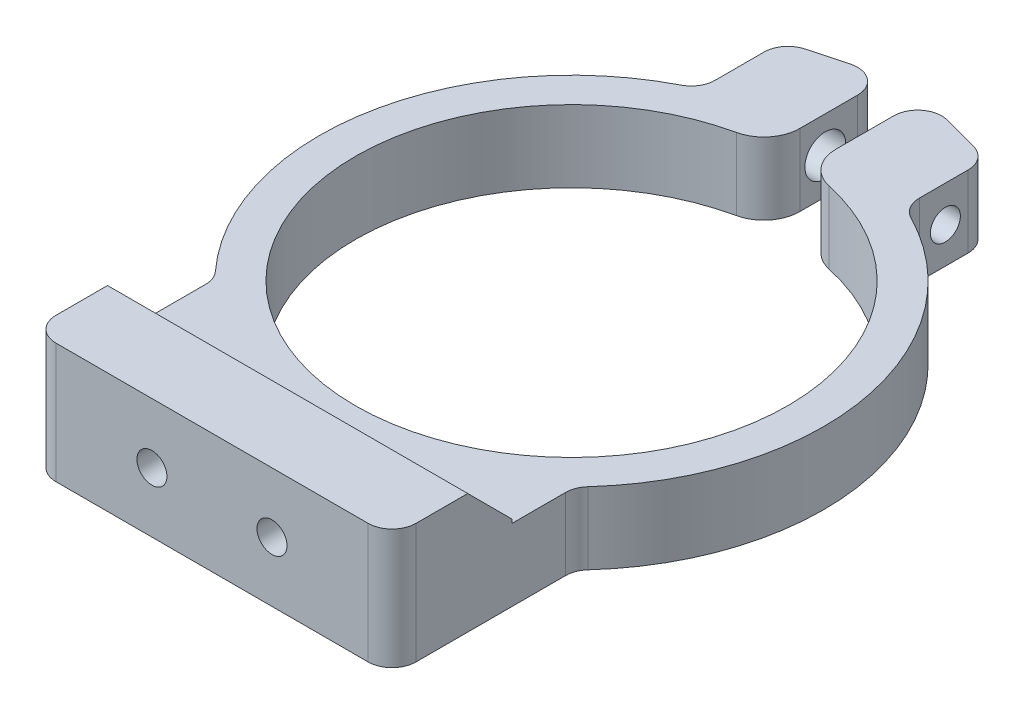
ISO-10303-21;
HEADER;
FILE_DESCRIPTION(('STEP AP214'),'2;1');
FILE_NAME('part.step','',(''),(''),'','','');
FILE_SCHEMA(('AUTOMOTIVE_DESIGN { 1 0 10303 214 1 1 1 1 }'));
ENDSEC;
DATA;
#1=APPLICATION_CONTEXT('core data for automotive mechanical design processes');
#2=APPLICATION_PROTOCOL_DEFINITION('international standard','automotive_design',2000,#1);
#3=PRODUCT_CONTEXT('',#1,'mechanical');
#4=PRODUCT('Part','Part','',(#3));
#5=PRODUCT_RELATED_PRODUCT_CATEGORY('part','',(#4));
#6=PRODUCT_DEFINITION_FORMATION('','',#4);
#7=PRODUCT_DEFINITION_CONTEXT('part definition',#1,'design');
#8=PRODUCT_DEFINITION('design','',#6,#7);
#9=PRODUCT_DEFINITION_SHAPE('','',#8);
#10=(LENGTH_UNIT() NAMED_UNIT(*) SI_UNIT(.MILLI.,.METRE.));
#11=(NAMED_UNIT(*) PLANE_ANGLE_UNIT() SI_UNIT($,.RADIAN.));
#12=(NAMED_UNIT(*) SI_UNIT($,.STERADIAN.) SOLID_ANGLE_UNIT());
#13=UNCERTAINTY_MEASURE_WITH_UNIT(LENGTH_MEASURE(1.E-05),#10,'distance_accuracy_value','');
#14=(GEOMETRIC_REPRESENTATION_CONTEXT(3) GLOBAL_UNCERTAINTY_ASSIGNED_CONTEXT((#13)) GLOBAL_UNIT_ASSIGNED_CONTEXT((#10,
#11,#12)) REPRESENTATION_CONTEXT('',''));
#15=CARTESIAN_POINT('',(0.,0.,0.));
#16=DIRECTION('',(0.,0.,1.));
#17=DIRECTION('',(1.,0.,0.));
#18=AXIS2_PLACEMENT_3D('',#15,#16,#17);
#19=CARTESIAN_POINT('',(0.,6.,0.));
#20=DIRECTION('',(0.,-1.,0.));
#21=DIRECTION('',(0.,0.,-1.));
#22=AXIS2_PLACEMENT_3D('',#19,#20,#21);
#23=CYLINDRICAL_SURFACE('',#22,21.);
#24=CARTESIAN_POINT('',(0.,0.,0.));
#25=DIRECTION('',(0.,1.,0.));
#26=DIRECTION('',(0.,0.,1.));
#27=AXIS2_PLACEMENT_3D('',#24,#25,#26);
#28=CIRCLE('',#27,21.);
#29=CARTESIAN_POINT('',(15.5217391304348,0.,14.1448087426706));
#30=VERTEX_POINT('',#29);
#31=CARTESIAN_POINT('',(9.58695652173913,0.,-18.6839574140567));
#32=VERTEX_POINT('',#31);
#33=EDGE_CURVE('E528',#30,#32,#28,.T.);
#34=ORIENTED_EDGE('',*,*,#33,.T.);
#35=DIRECTION('',(0.,-1.,0.));
#36=VECTOR('',#35,1.);
#37=CARTESIAN_POINT('',(9.58695652173913,6.,-18.6839574140567));
#38=LINE('',#37,#36);
#39=CARTESIAN_POINT('',(9.58695652173913,6.,-18.6839574140567));
#40=VERTEX_POINT('',#39);
#41=EDGE_CURVE('E424',#32,#40,#38,.F.);
#42=ORIENTED_EDGE('',*,*,#41,.T.);
#43=CARTESIAN_POINT('',(0.,6.,0.));
#44=DIRECTION('',(0.,1.,0.));
#45=DIRECTION('',(0.,0.,1.));
#46=AXIS2_PLACEMENT_3D('',#43,#44,#45);
#47=CIRCLE('',#46,21.);
#48=CARTESIAN_POINT('',(15.5217391304348,6.,14.1448087426706));
#49=VERTEX_POINT('',#48);
#50=EDGE_CURVE('E342',#49,#40,#47,.T.);
#51=ORIENTED_EDGE('',*,*,#50,.F.);
#52=DIRECTION('',(0.,-1.,0.));
#53=VECTOR('',#52,1.);
#54=CARTESIAN_POINT('',(15.5217391304348,6.,14.1448087426706));
#55=LINE('',#54,#53);
#56=EDGE_CURVE('E421',#49,#30,#55,.T.);
#57=ORIENTED_EDGE('',*,*,#56,.T.);
#58=EDGE_LOOP('',(#34,#42,#51,#57));
#59=FACE_BOUND('',#58,.T.);
#60=ADVANCED_FACE('F52',(#59),#23,.T.);
#61=CARTESIAN_POINT('',(0.,6.,0.));
#62=DIRECTION('',(0.,1.,0.));
#63=DIRECTION('',(0.,0.,1.));
#64=AXIS2_PLACEMENT_3D('',#61,#62,#63);
#65=PLANE('',#64);
#66=DIRECTION('',(0.,0.,-1.));
#67=VECTOR('',#66,1.);
#68=CARTESIAN_POINT('',(1.5,6.,-16.));
#69=LINE('',#68,#67);
#70=CARTESIAN_POINT('',(1.50000000000001,6.,-20.512191496766));
#71=VERTEX_POINT('',#70);
#72=CARTESIAN_POINT('',(1.50000000000002,6.,-25.3309403689697));
#73=VERTEX_POINT('',#72);
#74=EDGE_CURVE('E322',#71,#73,#69,.T.);
#75=ORIENTED_EDGE('',*,*,#74,.F.);
#76=CARTESIAN_POINT('',(4.50000000000001,6.,-20.512191496766));
#77=DIRECTION('',(0.,1.,0.));
#78=DIRECTION('',(0.,0.,1.));
#79=AXIS2_PLACEMENT_3D('',#76,#77,#78);
#80=CIRCLE('',#79,3.);
#81=CARTESIAN_POINT('',(3.85714285714287,6.,-17.5818784257994));
#82=VERTEX_POINT('',#81);
#83=EDGE_CURVE('E447',#71,#82,#80,.T.);
#84=ORIENTED_EDGE('',*,*,#83,.T.);
#85=CARTESIAN_POINT('',(0.,6.,0.));
#86=DIRECTION('',(0.,1.,0.));
#87=DIRECTION('',(0.,0.,1.));
#88=AXIS2_PLACEMENT_3D('',#85,#86,#87);
#89=CIRCLE('',#88,18.);
#90=CARTESIAN_POINT('',(-3.85714285714287,6.,-17.5818784257994));
#91=VERTEX_POINT('',#90);
#92=EDGE_CURVE('E334',#91,#82,#89,.T.);
#93=ORIENTED_EDGE('',*,*,#92,.F.);
#94=CARTESIAN_POINT('',(-4.50000000000001,6.,-20.512191496766));
#95=DIRECTION('',(0.,1.,0.));
#96=DIRECTION('',(0.,0.,1.));
#97=AXIS2_PLACEMENT_3D('',#94,#95,#96);
#98=CIRCLE('',#97,3.);
#99=CARTESIAN_POINT('',(-1.50000000000001,6.,-20.512191496766));
#100=VERTEX_POINT('',#99);
#101=EDGE_CURVE('E445',#91,#100,#98,.T.);
#102=ORIENTED_EDGE('',*,*,#101,.T.);
#103=DIRECTION('',(0.,0.,1.));
#104=VECTOR('',#103,1.);
#105=CARTESIAN_POINT('',(-1.5,6.,-16.));
#106=LINE('',#105,#104);
#107=CARTESIAN_POINT('',(-1.50000000000002,6.,-25.3309403689697));
#108=VERTEX_POINT('',#107);
#109=EDGE_CURVE('E324',#108,#100,#106,.T.);
#110=ORIENTED_EDGE('',*,*,#109,.F.);
#111=CARTESIAN_POINT('',(-3.50000000000002,6.,-25.3309403689697));
#112=DIRECTION('',(0.,1.,0.));
#113=DIRECTION('',(0.,0.,1.));
#114=AXIS2_PLACEMENT_3D('',#111,#112,#113);
#115=CIRCLE('',#114,2.);
#116=CARTESIAN_POINT('',(-4.01763809020507,6.,-27.2627920215478));
#117=VERTEX_POINT('',#116);
#118=EDGE_CURVE('E358',#108,#117,#115,.T.);
#119=ORIENTED_EDGE('',*,*,#118,.T.);
#120=DIRECTION('',(-0.965925826289067,0.,0.258819045102525));
#121=VECTOR('',#120,1.);
#122=CARTESIAN_POINT('',(-1.5,6.,-27.9373911146521));
#123=LINE('',#122,#121);
#124=CARTESIAN_POINT('',(-7.01763809020506,6.,-26.4589444442544));
#125=VERTEX_POINT('',#124);
#126=EDGE_CURVE('E278',#117,#125,#123,.T.);
#127=ORIENTED_EDGE('',*,*,#126,.T.);
#128=CARTESIAN_POINT('',(-6.5,6.,-24.5270927916763));
#129=DIRECTION('',(0.,1.,0.));
#130=DIRECTION('',(0.,0.,1.));
#131=AXIS2_PLACEMENT_3D('',#128,#129,#130);
#132=CIRCLE('',#131,2.);
#133=CARTESIAN_POINT('',(-8.5,6.,-24.5270927916763));
#134=VERTEX_POINT('',#133);
#135=EDGE_CURVE('E356',#125,#134,#132,.T.);
#136=ORIENTED_EDGE('',*,*,#135,.T.);
#137=DIRECTION('',(0.,0.,1.));
#138=VECTOR('',#137,1.);
#139=CARTESIAN_POINT('',(-8.5,6.,-17.9373911146521));
#140=LINE('',#139,#138);
#141=CARTESIAN_POINT('',(-8.5,6.,-20.4633819296811));
#142=VERTEX_POINT('',#141);
#143=EDGE_CURVE('E283',#134,#142,#140,.T.);
#144=ORIENTED_EDGE('',*,*,#143,.T.);
#145=CARTESIAN_POINT('',(-10.5,6.,-20.4633819296811));
#146=DIRECTION('',(0.,1.,0.));
#147=DIRECTION('',(0.,0.,1.));
#148=AXIS2_PLACEMENT_3D('',#145,#146,#147);
#149=CIRCLE('',#148,2.);
#150=CARTESIAN_POINT('',(-9.58695652173913,6.,-18.6839574140567));
#151=VERTEX_POINT('',#150);
#152=EDGE_CURVE('E441',#142,#151,#149,.F.);
#153=ORIENTED_EDGE('',*,*,#152,.T.);
#154=CARTESIAN_POINT('',(-15.5217391304348,6.,14.1448087426706));
#155=VERTEX_POINT('',#154);
#156=EDGE_CURVE('E346',#151,#155,#47,.T.);
#157=ORIENTED_EDGE('',*,*,#156,.T.);
#158=CARTESIAN_POINT('',(-17.,6.,15.4919333848297));
#159=DIRECTION('',(0.,1.,0.));
#160=DIRECTION('',(0.,0.,1.));
#161=AXIS2_PLACEMENT_3D('',#158,#159,#160);
#162=CIRCLE('',#161,2.);
#163=CARTESIAN_POINT('',(-15.,6.,15.4919333848297));
#164=VERTEX_POINT('',#163);
#165=EDGE_CURVE('E429',#155,#164,#162,.F.);
#166=ORIENTED_EDGE('',*,*,#165,.T.);
#167=DIRECTION('',(0.,0.,1.));
#168=VECTOR('',#167,1.);
#169=CARTESIAN_POINT('',(-15.,6.,14.6969384566991));
#170=LINE('',#169,#168);
#171=CARTESIAN_POINT('',(-15.,6.,19.9498743710662));
#172=VERTEX_POINT('',#171);
#173=EDGE_CURVE('E345',#164,#172,#170,.T.);
#174=ORIENTED_EDGE('',*,*,#173,.T.);
#175=DIRECTION('',(-1.,0.,0.));
#176=VECTOR('',#175,1.);
#177=CARTESIAN_POINT('',(-15.,6.,19.9498743710662));
#178=LINE('',#177,#176);
#179=CARTESIAN_POINT('',(15.,6.,19.9498743710662));
#180=VERTEX_POINT('',#179);
#181=EDGE_CURVE('E290',#180,#172,#178,.T.);
#182=ORIENTED_EDGE('',*,*,#181,.F.);
#183=DIRECTION('',(0.,0.,-1.));
#184=VECTOR('',#183,1.);
#185=CARTESIAN_POINT('',(15.,6.,29.9498743710662));
#186=LINE('',#185,#184);
#187=CARTESIAN_POINT('',(15.,6.,15.4919333848297));
#188=VERTEX_POINT('',#187);
#189=EDGE_CURVE('E308',#180,#188,#186,.T.);
#190=ORIENTED_EDGE('',*,*,#189,.T.);
#191=CARTESIAN_POINT('',(17.,6.,15.4919333848297));
#192=DIRECTION('',(0.,1.,0.));
#193=DIRECTION('',(0.,0.,1.));
#194=AXIS2_PLACEMENT_3D('',#191,#192,#193);
#195=CIRCLE('',#194,2.);
#196=EDGE_CURVE('E437',#188,#49,#195,.F.);
#197=ORIENTED_EDGE('',*,*,#196,.T.);
#198=ORIENTED_EDGE('',*,*,#50,.T.);
#199=CARTESIAN_POINT('',(10.5,6.,-20.4633819296811));
#200=DIRECTION('',(0.,1.,0.));
#201=DIRECTION('',(0.,0.,1.));
#202=AXIS2_PLACEMENT_3D('',#199,#200,#201);
#203=CIRCLE('',#202,2.);
#204=CARTESIAN_POINT('',(8.5,6.,-20.4633819296811));
#205=VERTEX_POINT('',#204);
#206=EDGE_CURVE('E431',#40,#205,#203,.F.);
#207=ORIENTED_EDGE('',*,*,#206,.T.);
#208=DIRECTION('',(0.,0.,-1.));
#209=VECTOR('',#208,1.);
#210=CARTESIAN_POINT('',(8.5,6.,-17.9373911146521));
#211=LINE('',#210,#209);
#212=CARTESIAN_POINT('',(8.5,6.,-24.5270927916763));
#213=VERTEX_POINT('',#212);
#214=EDGE_CURVE('E266',#205,#213,#211,.T.);
#215=ORIENTED_EDGE('',*,*,#214,.T.);
#216=CARTESIAN_POINT('',(6.5,6.,-24.5270927916763));
#217=DIRECTION('',(0.,1.,0.));
#218=DIRECTION('',(0.,0.,1.));
#219=AXIS2_PLACEMENT_3D('',#216,#217,#218);
#220=CIRCLE('',#219,2.);
#221=CARTESIAN_POINT('',(7.01763809020505,6.,-26.4589444442544));
#222=VERTEX_POINT('',#221);
#223=EDGE_CURVE('E362',#213,#222,#220,.T.);
#224=ORIENTED_EDGE('',*,*,#223,.T.);
#225=DIRECTION('',(-0.965925826289067,0.,-0.258819045102525));
#226=VECTOR('',#225,1.);
#227=CARTESIAN_POINT('',(1.5,6.,-27.9373911146521));
#228=LINE('',#227,#226);
#229=CARTESIAN_POINT('',(4.01763809020507,6.,-27.2627920215478));
#230=VERTEX_POINT('',#229);
#231=EDGE_CURVE('E271',#222,#230,#228,.T.);
#232=ORIENTED_EDGE('',*,*,#231,.T.);
#233=CARTESIAN_POINT('',(3.50000000000002,6.,-25.3309403689697));
#234=DIRECTION('',(0.,1.,0.));
#235=DIRECTION('',(0.,0.,1.));
#236=AXIS2_PLACEMENT_3D('',#233,#234,#235);
#237=CIRCLE('',#236,2.);
#238=EDGE_CURVE('E360',#230,#73,#237,.T.);
#239=ORIENTED_EDGE('',*,*,#238,.T.);
#240=EDGE_LOOP('',(#75,#84,#93,#102,#110,#119,#127,#136,#144,#153,#157,#166,#174,#182,#190,#197,
#198,#207,#215,#224,#232,#239));
#241=FACE_BOUND('',#240,.T.);
#242=ADVANCED_FACE('F500',(#241),#65,.T.);
#243=CARTESIAN_POINT('',(0.,0.,0.));
#244=DIRECTION('',(0.,1.,0.));
#245=DIRECTION('',(0.,0.,1.));
#246=AXIS2_PLACEMENT_3D('',#243,#244,#245);
#247=PLANE('',#246);
#248=CARTESIAN_POINT('',(0.,0.,0.));
#249=DIRECTION('',(0.,1.,0.));
#250=DIRECTION('',(0.,0.,1.));
#251=AXIS2_PLACEMENT_3D('',#248,#249,#250);
#252=CIRCLE('',#251,18.);
#253=CARTESIAN_POINT('',(-3.85714285714287,0.,-17.5818784257994));
#254=VERTEX_POINT('',#253);
#255=CARTESIAN_POINT('',(3.85714285714287,0.,-17.5818784257994));
#256=VERTEX_POINT('',#255);
#257=EDGE_CURVE('E338',#254,#256,#252,.T.);
#258=ORIENTED_EDGE('',*,*,#257,.T.);
#259=CARTESIAN_POINT('',(4.50000000000001,0.,-20.512191496766));
#260=DIRECTION('',(0.,1.,0.));
#261=DIRECTION('',(0.,0.,1.));
#262=AXIS2_PLACEMENT_3D('',#259,#260,#261);
#263=CIRCLE('',#262,3.);
#264=CARTESIAN_POINT('',(1.50000000000001,0.,-20.512191496766));
#265=VERTEX_POINT('',#264);
#266=EDGE_CURVE('E455',#256,#265,#263,.F.);
#267=ORIENTED_EDGE('',*,*,#266,.T.);
#268=DIRECTION('',(0.,0.,1.));
#269=VECTOR('',#268,1.);
#270=CARTESIAN_POINT('',(1.5,0.,-16.));
#271=LINE('',#270,#269);
#272=CARTESIAN_POINT('',(1.50000000000002,0.,-25.3309403689697));
#273=VERTEX_POINT('',#272);
#274=EDGE_CURVE('E332',#273,#265,#271,.T.);
#275=ORIENTED_EDGE('',*,*,#274,.F.);
#276=CARTESIAN_POINT('',(3.50000000000002,0.,-25.3309403689697));
#277=DIRECTION('',(0.,1.,0.));
#278=DIRECTION('',(0.,0.,1.));
#279=AXIS2_PLACEMENT_3D('',#276,#277,#278);
#280=CIRCLE('',#279,2.);
#281=CARTESIAN_POINT('',(4.01763809020507,0.,-27.2627920215478));
#282=VERTEX_POINT('',#281);
#283=EDGE_CURVE('E378',#273,#282,#280,.F.);
#284=ORIENTED_EDGE('',*,*,#283,.T.);
#285=DIRECTION('',(0.965925826289067,0.,0.258819045102525));
#286=VECTOR('',#285,1.);
#287=CARTESIAN_POINT('',(1.5,0.,-27.9373911146521));
#288=LINE('',#287,#286);
#289=CARTESIAN_POINT('',(7.01763809020505,0.,-26.4589444442544));
#290=VERTEX_POINT('',#289);
#291=EDGE_CURVE('E267',#282,#290,#288,.T.);
#292=ORIENTED_EDGE('',*,*,#291,.T.);
#293=CARTESIAN_POINT('',(6.5,0.,-24.5270927916763));
#294=DIRECTION('',(0.,1.,0.));
#295=DIRECTION('',(0.,0.,1.));
#296=AXIS2_PLACEMENT_3D('',#293,#294,#295);
#297=CIRCLE('',#296,2.);
#298=CARTESIAN_POINT('',(8.5,0.,-24.5270927916763));
#299=VERTEX_POINT('',#298);
#300=EDGE_CURVE('E380',#290,#299,#297,.F.);
#301=ORIENTED_EDGE('',*,*,#300,.T.);
#302=DIRECTION('',(0.,0.,1.));
#303=VECTOR('',#302,1.);
#304=CARTESIAN_POINT('',(8.5,0.,-17.9373911146521));
#305=LINE('',#304,#303);
#306=CARTESIAN_POINT('',(8.5,0.,-20.4633819296811));
#307=VERTEX_POINT('',#306);
#308=EDGE_CURVE('E270',#299,#307,#305,.T.);
#309=ORIENTED_EDGE('',*,*,#308,.T.);
#310=CARTESIAN_POINT('',(10.5,0.,-20.4633819296811));
#311=DIRECTION('',(0.,1.,0.));
#312=DIRECTION('',(0.,0.,1.));
#313=AXIS2_PLACEMENT_3D('',#310,#311,#312);
#314=CIRCLE('',#313,2.);
#315=EDGE_CURVE('E433',#307,#32,#314,.T.);
#316=ORIENTED_EDGE('',*,*,#315,.T.);
#317=ORIENTED_EDGE('',*,*,#33,.F.);
#318=CARTESIAN_POINT('',(17.,0.,15.4919333848297));
#319=DIRECTION('',(0.,1.,0.));
#320=DIRECTION('',(0.,0.,1.));
#321=AXIS2_PLACEMENT_3D('',#318,#319,#320);
#322=CIRCLE('',#321,2.);
#323=CARTESIAN_POINT('',(15.,0.,15.4919333848297));
#324=VERTEX_POINT('',#323);
#325=EDGE_CURVE('E435',#30,#324,#322,.T.);
#326=ORIENTED_EDGE('',*,*,#325,.T.);
#327=DIRECTION('',(0.,0.,-1.));
#328=VECTOR('',#327,1.);
#329=CARTESIAN_POINT('',(15.,0.,29.9498743710662));
#330=LINE('',#329,#328);
#331=CARTESIAN_POINT('',(15.,0.,27.9498743710662));
#332=VERTEX_POINT('',#331);
#333=EDGE_CURVE('E529',#332,#324,#330,.T.);
#334=ORIENTED_EDGE('',*,*,#333,.F.);
#335=CARTESIAN_POINT('',(13.,0.,27.9498743710662));
#336=DIRECTION('',(0.,1.,0.));
#337=DIRECTION('',(0.,0.,1.));
#338=AXIS2_PLACEMENT_3D('',#335,#336,#337);
#339=CIRCLE('',#338,2.);
#340=CARTESIAN_POINT('',(13.,0.,29.9498743710662));
#341=VERTEX_POINT('',#340);
#342=EDGE_CURVE('E371',#332,#341,#339,.F.);
#343=ORIENTED_EDGE('',*,*,#342,.T.);
#344=DIRECTION('',(1.,0.,0.));
#345=VECTOR('',#344,1.);
#346=CARTESIAN_POINT('',(-15.,0.,29.9498743710662));
#347=LINE('',#346,#345);
#348=CARTESIAN_POINT('',(-13.,0.,29.9498743710662));
#349=VERTEX_POINT('',#348);
#350=EDGE_CURVE('E337',#349,#341,#347,.T.);
#351=ORIENTED_EDGE('',*,*,#350,.F.);
#352=CARTESIAN_POINT('',(-13.,0.,27.9498743710662));
#353=DIRECTION('',(0.,1.,0.));
#354=DIRECTION('',(0.,0.,1.));
#355=AXIS2_PLACEMENT_3D('',#352,#353,#354);
#356=CIRCLE('',#355,2.);
#357=CARTESIAN_POINT('',(-15.,0.,27.9498743710662));
#358=VERTEX_POINT('',#357);
#359=EDGE_CURVE('E369',#349,#358,#356,.F.);
#360=ORIENTED_EDGE('',*,*,#359,.T.);
#361=DIRECTION('',(0.,0.,1.));
#362=VECTOR('',#361,1.);
#363=CARTESIAN_POINT('',(-15.,0.,14.6969384566991));
#364=LINE('',#363,#362);
#365=CARTESIAN_POINT('',(-15.,0.,15.4919333848297));
#366=VERTEX_POINT('',#365);
#367=EDGE_CURVE('E473',#366,#358,#364,.T.);
#368=ORIENTED_EDGE('',*,*,#367,.F.);
#369=CARTESIAN_POINT('',(-17.,0.,15.4919333848297));
#370=DIRECTION('',(0.,1.,0.));
#371=DIRECTION('',(0.,0.,1.));
#372=AXIS2_PLACEMENT_3D('',#369,#370,#371);
#373=CIRCLE('',#372,2.);
#374=CARTESIAN_POINT('',(-15.5217391304348,0.,14.1448087426706));
#375=VERTEX_POINT('',#374);
#376=EDGE_CURVE('E427',#366,#375,#373,.T.);
#377=ORIENTED_EDGE('',*,*,#376,.T.);
#378=CARTESIAN_POINT('',(-9.58695652173913,0.,-18.6839574140567));
#379=VERTEX_POINT('',#378);
#380=EDGE_CURVE('E522',#379,#375,#28,.T.);
#381=ORIENTED_EDGE('',*,*,#380,.F.);
#382=CARTESIAN_POINT('',(-10.5,0.,-20.4633819296811));
#383=DIRECTION('',(0.,1.,0.));
#384=DIRECTION('',(0.,0.,1.));
#385=AXIS2_PLACEMENT_3D('',#382,#383,#384);
#386=CIRCLE('',#385,2.);
#387=CARTESIAN_POINT('',(-8.5,0.,-20.4633819296811));
#388=VERTEX_POINT('',#387);
#389=EDGE_CURVE('E439',#379,#388,#386,.T.);
#390=ORIENTED_EDGE('',*,*,#389,.T.);
#391=DIRECTION('',(0.,0.,-1.));
#392=VECTOR('',#391,1.);
#393=CARTESIAN_POINT('',(-8.5,0.,-17.9373911146521));
#394=LINE('',#393,#392);
#395=CARTESIAN_POINT('',(-8.5,0.,-24.5270927916763));
#396=VERTEX_POINT('',#395);
#397=EDGE_CURVE('E279',#388,#396,#394,.T.);
#398=ORIENTED_EDGE('',*,*,#397,.T.);
#399=CARTESIAN_POINT('',(-6.5,0.,-24.5270927916763));
#400=DIRECTION('',(0.,1.,0.));
#401=DIRECTION('',(0.,0.,1.));
#402=AXIS2_PLACEMENT_3D('',#399,#400,#401);
#403=CIRCLE('',#402,2.);
#404=CARTESIAN_POINT('',(-7.01763809020506,0.,-26.4589444442544));
#405=VERTEX_POINT('',#404);
#406=EDGE_CURVE('E373',#396,#405,#403,.F.);
#407=ORIENTED_EDGE('',*,*,#406,.T.);
#408=DIRECTION('',(0.965925826289067,0.,-0.258819045102525));
#409=VECTOR('',#408,1.);
#410=CARTESIAN_POINT('',(-1.5,0.,-27.9373911146521));
#411=LINE('',#410,#409);
#412=CARTESIAN_POINT('',(-4.01763809020507,0.,-27.2627920215478));
#413=VERTEX_POINT('',#412);
#414=EDGE_CURVE('E282',#405,#413,#411,.T.);
#415=ORIENTED_EDGE('',*,*,#414,.T.);
#416=CARTESIAN_POINT('',(-3.50000000000002,0.,-25.3309403689697));
#417=DIRECTION('',(0.,1.,0.));
#418=DIRECTION('',(0.,0.,1.));
#419=AXIS2_PLACEMENT_3D('',#416,#417,#418);
#420=CIRCLE('',#419,2.);
#421=CARTESIAN_POINT('',(-1.50000000000002,0.,-25.3309403689697));
#422=VERTEX_POINT('',#421);
#423=EDGE_CURVE('E375',#413,#422,#420,.F.);
#424=ORIENTED_EDGE('',*,*,#423,.T.);
#425=DIRECTION('',(0.,0.,-1.));
#426=VECTOR('',#425,1.);
#427=CARTESIAN_POINT('',(-1.5,0.,-16.));
#428=LINE('',#427,#426);
#429=CARTESIAN_POINT('',(-1.50000000000001,0.,-20.512191496766));
#430=VERTEX_POINT('',#429);
#431=EDGE_CURVE('E302',#430,#422,#428,.T.);
#432=ORIENTED_EDGE('',*,*,#431,.F.);
#433=CARTESIAN_POINT('',(-4.50000000000001,0.,-20.512191496766));
#434=DIRECTION('',(0.,1.,0.));
#435=DIRECTION('',(0.,0.,1.));
#436=AXIS2_PLACEMENT_3D('',#433,#434,#435);
#437=CIRCLE('',#436,3.);
#438=EDGE_CURVE('E453',#430,#254,#437,.F.);
#439=ORIENTED_EDGE('',*,*,#438,.T.);
#440=EDGE_LOOP('',(#258,#267,#275,#284,#292,#301,#309,#316,#317,#326,#334,#343,#351,#360,#368,
#377,#381,#390,#398,#407,#415,#424,#432,#439));
#441=FACE_BOUND('',#440,.T.);
#442=ADVANCED_FACE('F507',(#441),#247,.F.);
#443=CARTESIAN_POINT('',(-15.,6.,29.9498743710662));
#444=DIRECTION('',(0.,0.,-1.));
#445=DIRECTION('',(-1.,0.,0.));
#446=AXIS2_PLACEMENT_3D('',#443,#444,#445);
#447=PLANE('',#446);
#448=CARTESIAN_POINT('',(-5.,5.,29.9498743710662));
#449=DIRECTION('',(0.,0.,1.));
#450=DIRECTION('',(1.,0.,0.));
#451=AXIS2_PLACEMENT_3D('',#448,#449,#450);
#452=CIRCLE('',#451,1.24999999999999);
#453=CARTESIAN_POINT('',(-3.75000000000001,5.,29.9498743710662));
#454=VERTEX_POINT('',#453);
#455=EDGE_CURVE('E244',#454,#454,#452,.T.);
#456=ORIENTED_EDGE('',*,*,#455,.F.);
#457=EDGE_LOOP('',(#456));
#458=FACE_BOUND('',#457,.T.);
#459=CARTESIAN_POINT('',(5.,5.,29.9498743710662));
#460=DIRECTION('',(0.,0.,1.));
#461=DIRECTION('',(1.,0.,0.));
#462=AXIS2_PLACEMENT_3D('',#459,#460,#461);
#463=CIRCLE('',#462,1.24999999999999);
#464=CARTESIAN_POINT('',(6.24999999999999,5.,29.9498743710662));
#465=VERTEX_POINT('',#464);
#466=EDGE_CURVE('E243',#465,#465,#463,.T.);
#467=ORIENTED_EDGE('',*,*,#466,.F.);
#468=EDGE_LOOP('',(#467));
#469=FACE_BOUND('',#468,.T.);
#470=ORIENTED_EDGE('',*,*,#350,.T.);
#471=DIRECTION('',(0.,-1.,0.));
#472=VECTOR('',#471,1.);
#473=CARTESIAN_POINT('',(13.,6.,29.9498743710662));
#474=LINE('',#473,#472);
#475=CARTESIAN_POINT('',(13.,10.,29.9498743710662));
#476=VERTEX_POINT('',#475);
#477=EDGE_CURVE('E404',#341,#476,#474,.F.);
#478=ORIENTED_EDGE('',*,*,#477,.T.);
#479=DIRECTION('',(1.,0.,0.));
#480=VECTOR('',#479,1.);
#481=CARTESIAN_POINT('',(-15.,10.,29.9498743710662));
#482=LINE('',#481,#480);
#483=CARTESIAN_POINT('',(-13.,10.,29.9498743710662));
#484=VERTEX_POINT('',#483);
#485=EDGE_CURVE('E293',#484,#476,#482,.T.);
#486=ORIENTED_EDGE('',*,*,#485,.F.);
#487=DIRECTION('',(0.,-1.,0.));
#488=VECTOR('',#487,1.);
#489=CARTESIAN_POINT('',(-13.,6.,29.9498743710662));
#490=LINE('',#489,#488);
#491=EDGE_CURVE('E401',#484,#349,#490,.T.);
#492=ORIENTED_EDGE('',*,*,#491,.T.);
#493=EDGE_LOOP('',(#470,#478,#486,#492));
#494=FACE_BOUND('',#493,.T.);
#495=ADVANCED_FACE('F481',(#458,#469,#494),#447,.F.);
#496=CARTESIAN_POINT('',(15.,6.,29.9498743710662));
#497=DIRECTION('',(-1.,0.,0.));
#498=DIRECTION('',(0.,0.,1.));
#499=AXIS2_PLACEMENT_3D('',#496,#497,#498);
#500=PLANE('',#499);
#501=DIRECTION('',(0.,-1.,0.));
#502=VECTOR('',#501,1.);
#503=CARTESIAN_POINT('',(15.,10.,19.9498743710662));
#504=LINE('',#503,#502);
#505=CARTESIAN_POINT('',(15.,6.29999999999998,19.9498743710662));
#506=VERTEX_POINT('',#505);
#507=EDGE_CURVE('E318',#506,#180,#504,.T.);
#508=ORIENTED_EDGE('',*,*,#507,.F.);
#509=DIRECTION('',(0.,-0.707106781186548,-0.707106781186548));
#510=VECTOR('',#509,1.);
#511=CARTESIAN_POINT('',(15.,10.,23.6498743710662));
#512=LINE('',#511,#510);
#513=CARTESIAN_POINT('',(15.,10.,23.6498743710662));
#514=VERTEX_POINT('',#513);
#515=EDGE_CURVE('E14',#506,#514,#512,.F.);
#516=ORIENTED_EDGE('',*,*,#515,.T.);
#517=DIRECTION('',(0.,0.,-1.));
#518=VECTOR('',#517,1.);
#519=CARTESIAN_POINT('',(15.,10.,29.9498743710662));
#520=LINE('',#519,#518);
#521=CARTESIAN_POINT('',(15.,10.,27.9498743710662));
#522=VERTEX_POINT('',#521);
#523=EDGE_CURVE('E296',#522,#514,#520,.T.);
#524=ORIENTED_EDGE('',*,*,#523,.F.);
#525=DIRECTION('',(0.,-1.,0.));
#526=VECTOR('',#525,1.);
#527=CARTESIAN_POINT('',(15.,6.,27.9498743710662));
#528=LINE('',#527,#526);
#529=EDGE_CURVE('E398',#522,#332,#528,.T.);
#530=ORIENTED_EDGE('',*,*,#529,.T.);
#531=ORIENTED_EDGE('',*,*,#333,.T.);
#532=DIRECTION('',(0.,1.,0.));
#533=VECTOR('',#532,1.);
#534=CARTESIAN_POINT('',(15.,6.,15.4919333848297));
#535=LINE('',#534,#533);
#536=EDGE_CURVE('E396',#324,#188,#535,.T.);
#537=ORIENTED_EDGE('',*,*,#536,.T.);
#538=ORIENTED_EDGE('',*,*,#189,.F.);
#539=EDGE_LOOP('',(#508,#516,#524,#530,#531,#537,#538));
#540=FACE_BOUND('',#539,.T.);
#541=ADVANCED_FACE('F488',(#540),#500,.F.);
#542=ORIENTED_EDGE('',*,*,#380,.T.);
#543=DIRECTION('',(0.,-1.,0.));
#544=VECTOR('',#543,1.);
#545=CARTESIAN_POINT('',(-15.5217391304348,6.,14.1448087426706));
#546=LINE('',#545,#544);
#547=EDGE_CURVE('E419',#375,#155,#546,.F.);
#548=ORIENTED_EDGE('',*,*,#547,.T.);
#549=ORIENTED_EDGE('',*,*,#156,.F.);
#550=DIRECTION('',(0.,-1.,0.));
#551=VECTOR('',#550,1.);
#552=CARTESIAN_POINT('',(-9.58695652173913,6.,-18.6839574140567));
#553=LINE('',#552,#551);
#554=EDGE_CURVE('E416',#151,#379,#553,.T.);
#555=ORIENTED_EDGE('',*,*,#554,.T.);
#556=EDGE_LOOP('',(#542,#548,#549,#555));
#557=FACE_BOUND('',#556,.T.);
#558=ADVANCED_FACE('F503',(#557),#23,.T.);
#559=CARTESIAN_POINT('',(-15.,6.,14.6969384566991));
#560=DIRECTION('',(1.,0.,0.));
#561=DIRECTION('',(0.,0.,-1.));
#562=AXIS2_PLACEMENT_3D('',#559,#560,#561);
#563=PLANE('',#562);
#564=DIRECTION('',(0.,0.,1.));
#565=VECTOR('',#564,1.);
#566=CARTESIAN_POINT('',(-15.,10.,29.9498743710662));
#567=LINE('',#566,#565);
#568=CARTESIAN_POINT('',(-15.,10.,23.6498743710662));
#569=VERTEX_POINT('',#568);
#570=CARTESIAN_POINT('',(-15.,10.,27.9498743710662));
#571=VERTEX_POINT('',#570);
#572=EDGE_CURVE('E291',#569,#571,#567,.T.);
#573=ORIENTED_EDGE('',*,*,#572,.F.);
#574=DIRECTION('',(0.,0.707106781186548,0.707106781186548));
#575=VECTOR('',#574,1.);
#576=CARTESIAN_POINT('',(-15.,10.,23.6498743710662));
#577=LINE('',#576,#575);
#578=CARTESIAN_POINT('',(-15.,6.29999999999998,19.9498743710662));
#579=VERTEX_POINT('',#578);
#580=EDGE_CURVE('E74',#569,#579,#577,.F.);
#581=ORIENTED_EDGE('',*,*,#580,.T.);
#582=DIRECTION('',(0.,-1.,0.));
#583=VECTOR('',#582,1.);
#584=CARTESIAN_POINT('',(-15.,10.,19.9498743710662));
#585=LINE('',#584,#583);
#586=EDGE_CURVE('E299',#579,#172,#585,.T.);
#587=ORIENTED_EDGE('',*,*,#586,.T.);
#588=ORIENTED_EDGE('',*,*,#173,.F.);
#589=DIRECTION('',(0.,1.,0.));
#590=VECTOR('',#589,1.);
#591=CARTESIAN_POINT('',(-15.,0.,15.4919333848297));
#592=LINE('',#591,#590);
#593=EDGE_CURVE('E410',#164,#366,#592,.F.);
#594=ORIENTED_EDGE('',*,*,#593,.T.);
#595=ORIENTED_EDGE('',*,*,#367,.T.);
#596=DIRECTION('',(0.,-1.,0.));
#597=VECTOR('',#596,1.);
#598=CARTESIAN_POINT('',(-15.,6.,27.9498743710662));
#599=LINE('',#598,#597);
#600=EDGE_CURVE('E413',#358,#571,#599,.F.);
#601=ORIENTED_EDGE('',*,*,#600,.T.);
#602=EDGE_LOOP('',(#573,#581,#587,#588,#594,#595,#601));
#603=FACE_BOUND('',#602,.T.);
#604=ADVANCED_FACE('F468',(#603),#563,.F.);
#605=CARTESIAN_POINT('',(0.,6.,0.));
#606=DIRECTION('',(0.,-1.,0.));
#607=DIRECTION('',(0.,0.,-1.));
#608=AXIS2_PLACEMENT_3D('',#605,#606,#607);
#609=CYLINDRICAL_SURFACE('',#608,18.);
#610=ORIENTED_EDGE('',*,*,#92,.T.);
#611=DIRECTION('',(0.,-1.,0.));
#612=VECTOR('',#611,1.);
#613=CARTESIAN_POINT('',(3.85714285714287,6.,-17.5818784257994));
#614=LINE('',#613,#612);
#615=EDGE_CURVE('E451',#82,#256,#614,.T.);
#616=ORIENTED_EDGE('',*,*,#615,.T.);
#617=ORIENTED_EDGE('',*,*,#257,.F.);
#618=DIRECTION('',(0.,-1.,0.));
#619=VECTOR('',#618,1.);
#620=CARTESIAN_POINT('',(-3.85714285714287,6.,-17.5818784257994));
#621=LINE('',#620,#619);
#622=EDGE_CURVE('E449',#254,#91,#621,.F.);
#623=ORIENTED_EDGE('',*,*,#622,.T.);
#624=EDGE_LOOP('',(#610,#616,#617,#623));
#625=FACE_BOUND('',#624,.T.);
#626=ADVANCED_FACE('F519',(#625),#609,.F.);
#627=CARTESIAN_POINT('',(-1.5,-5.83095189484531,-16.));
#628=DIRECTION('',(-1.,0.,0.));
#629=DIRECTION('',(0.,0.,1.));
#630=AXIS2_PLACEMENT_3D('',#627,#628,#629);
#631=PLANE('',#630);
#632=CARTESIAN_POINT('',(-1.50000000000002,3.,-22.6323055686529));
#633=DIRECTION('',(-1.,0.,0.));
#634=DIRECTION('',(0.,0.,1.));
#635=AXIS2_PLACEMENT_3D('',#632,#633,#634);
#636=CIRCLE('',#635,1.7);
#637=CARTESIAN_POINT('',(-1.50000000000001,3.,-20.9323055686529));
#638=VERTEX_POINT('',#637);
#639=EDGE_CURVE('E263',#638,#638,#636,.T.);
#640=ORIENTED_EDGE('',*,*,#639,.T.);
#641=EDGE_LOOP('',(#640));
#642=FACE_BOUND('',#641,.T.);
#643=ORIENTED_EDGE('',*,*,#109,.T.);
#644=DIRECTION('',(0.,1.,0.));
#645=VECTOR('',#644,1.);
#646=CARTESIAN_POINT('',(-1.50000000000001,0.,-20.512191496766));
#647=LINE('',#646,#645);
#648=EDGE_CURVE('E456',#100,#430,#647,.F.);
#649=ORIENTED_EDGE('',*,*,#648,.T.);
#650=ORIENTED_EDGE('',*,*,#431,.T.);
#651=DIRECTION('',(0.,1.,0.));
#652=VECTOR('',#651,1.);
#653=CARTESIAN_POINT('',(-1.50000000000002,6.,-25.3309403689697));
#654=LINE('',#653,#652);
#655=EDGE_CURVE('E384',#422,#108,#654,.T.);
#656=ORIENTED_EDGE('',*,*,#655,.T.);
#657=EDGE_LOOP('',(#643,#649,#650,#656));
#658=FACE_BOUND('',#657,.T.);
#659=ADVANCED_FACE('F581',(#642,#658),#631,.F.);
#660=CARTESIAN_POINT('',(1.5,-5.83095189484531,-16.));
#661=DIRECTION('',(1.,0.,0.));
#662=DIRECTION('',(0.,0.,-1.));
#663=AXIS2_PLACEMENT_3D('',#660,#661,#662);
#664=PLANE('',#663);
#665=CARTESIAN_POINT('',(1.50000000000007,3.,-22.6323055686528));
#666=DIRECTION('',(-1.,0.,0.));
#667=DIRECTION('',(0.,0.,1.));
#668=AXIS2_PLACEMENT_3D('',#665,#666,#667);
#669=CIRCLE('',#668,1.24999999999999);
#670=CARTESIAN_POINT('',(1.50000000000006,3.,-21.3823055686528));
#671=VERTEX_POINT('',#670);
#672=EDGE_CURVE('E254',#671,#671,#669,.T.);
#673=ORIENTED_EDGE('',*,*,#672,.F.);
#674=EDGE_LOOP('',(#673));
#675=FACE_BOUND('',#674,.T.);
#676=ORIENTED_EDGE('',*,*,#274,.T.);
#677=DIRECTION('',(0.,1.,0.));
#678=VECTOR('',#677,1.);
#679=CARTESIAN_POINT('',(1.50000000000001,6.,-20.512191496766));
#680=LINE('',#679,#678);
#681=EDGE_CURVE('E443',#265,#71,#680,.T.);
#682=ORIENTED_EDGE('',*,*,#681,.T.);
#683=ORIENTED_EDGE('',*,*,#74,.T.);
#684=DIRECTION('',(0.,1.,0.));
#685=VECTOR('',#684,1.);
#686=CARTESIAN_POINT('',(1.50000000000002,0.,-25.3309403689697));
#687=LINE('',#686,#685);
#688=EDGE_CURVE('E382',#73,#273,#687,.F.);
#689=ORIENTED_EDGE('',*,*,#688,.T.);
#690=EDGE_LOOP('',(#676,#682,#683,#689));
#691=FACE_BOUND('',#690,.T.);
#692=ADVANCED_FACE('F580',(#675,#691),#664,.F.);
#693=CARTESIAN_POINT('',(-15.,10.,19.9498743710662));
#694=DIRECTION('',(0.,0.,1.));
#695=DIRECTION('',(1.,0.,0.));
#696=AXIS2_PLACEMENT_3D('',#693,#694,#695);
#697=PLANE('',#696);
#698=ORIENTED_EDGE('',*,*,#586,.F.);
#699=DIRECTION('',(1.,0.,0.));
#700=VECTOR('',#699,1.);
#701=CARTESIAN_POINT('',(-15.,6.29999999999998,19.9498743710662));
#702=LINE('',#701,#700);
#703=EDGE_CURVE('E60',#579,#506,#702,.T.);
#704=ORIENTED_EDGE('',*,*,#703,.T.);
#705=ORIENTED_EDGE('',*,*,#507,.T.);
#706=ORIENTED_EDGE('',*,*,#181,.T.);
#707=EDGE_LOOP('',(#698,#704,#705,#706));
#708=FACE_BOUND('',#707,.T.);
#709=ADVANCED_FACE('F536',(#708),#697,.F.);
#710=CARTESIAN_POINT('',(0.,10.,0.));
#711=DIRECTION('',(0.,-1.,0.));
#712=DIRECTION('',(0.,0.,-1.));
#713=AXIS2_PLACEMENT_3D('',#710,#711,#712);
#714=PLANE('',#713);
#715=ORIENTED_EDGE('',*,*,#523,.T.);
#716=DIRECTION('',(-1.,0.,0.));
#717=VECTOR('',#716,1.);
#718=CARTESIAN_POINT('',(0.,10.,23.6498743710662));
#719=LINE('',#718,#717);
#720=EDGE_CURVE('E319',#514,#569,#719,.T.);
#721=ORIENTED_EDGE('',*,*,#720,.T.);
#722=ORIENTED_EDGE('',*,*,#572,.T.);
#723=CARTESIAN_POINT('',(-13.,10.,27.9498743710662));
#724=DIRECTION('',(0.,-1.,0.));
#725=DIRECTION('',(0.,0.,-1.));
#726=AXIS2_PLACEMENT_3D('',#723,#724,#725);
#727=CIRCLE('',#726,2.);
#728=EDGE_CURVE('E406',#571,#484,#727,.F.);
#729=ORIENTED_EDGE('',*,*,#728,.T.);
#730=ORIENTED_EDGE('',*,*,#485,.T.);
#731=CARTESIAN_POINT('',(13.,10.,27.9498743710662));
#732=DIRECTION('',(0.,-1.,0.));
#733=DIRECTION('',(0.,0.,-1.));
#734=AXIS2_PLACEMENT_3D('',#731,#732,#733);
#735=CIRCLE('',#734,2.);
#736=EDGE_CURVE('E408',#476,#522,#735,.F.);
#737=ORIENTED_EDGE('',*,*,#736,.T.);
#738=EDGE_LOOP('',(#715,#721,#722,#729,#730,#737));
#739=FACE_BOUND('',#738,.T.);
#740=ADVANCED_FACE('F464',(#739),#714,.F.);
#741=CARTESIAN_POINT('',(-8.5,-12.2065556157337,-17.9373911146521));
#742=DIRECTION('',(-1.,0.,0.));
#743=DIRECTION('',(0.,0.,1.));
#744=AXIS2_PLACEMENT_3D('',#741,#742,#743);
#745=PLANE('',#744);
#746=CARTESIAN_POINT('',(-8.5,3.,-22.6323055686529));
#747=DIRECTION('',(-1.,0.,0.));
#748=DIRECTION('',(0.,0.,1.));
#749=AXIS2_PLACEMENT_3D('',#746,#747,#748);
#750=CIRCLE('',#749,1.7);
#751=CARTESIAN_POINT('',(-8.5,3.,-20.9323055686529));
#752=VERTEX_POINT('',#751);
#753=EDGE_CURVE('E260',#752,#752,#750,.T.);
#754=ORIENTED_EDGE('',*,*,#753,.F.);
#755=EDGE_LOOP('',(#754));
#756=FACE_BOUND('',#755,.T.);
#757=ORIENTED_EDGE('',*,*,#143,.F.);
#758=DIRECTION('',(0.,1.,0.));
#759=VECTOR('',#758,1.);
#760=CARTESIAN_POINT('',(-8.5,-12.2065556157337,-24.5270927916763));
#761=LINE('',#760,#759);
#762=EDGE_CURVE('E394',#134,#396,#761,.F.);
#763=ORIENTED_EDGE('',*,*,#762,.T.);
#764=ORIENTED_EDGE('',*,*,#397,.F.);
#765=DIRECTION('',(0.,-1.,0.));
#766=VECTOR('',#765,1.);
#767=CARTESIAN_POINT('',(-8.5,-12.2065556157337,-20.4633819296811));
#768=LINE('',#767,#766);
#769=EDGE_CURVE('E392',#388,#142,#768,.F.);
#770=ORIENTED_EDGE('',*,*,#769,.T.);
#771=EDGE_LOOP('',(#757,#763,#764,#770));
#772=FACE_BOUND('',#771,.T.);
#773=ADVANCED_FACE('F600',(#756,#772),#745,.T.);
#774=CARTESIAN_POINT('',(-1.5,-12.2065556157337,-27.9373911146521));
#775=DIRECTION('',(-0.258819045102525,0.,-0.965925826289067));
#776=DIRECTION('',(-0.965925826289067,0.,0.258819045102525));
#777=AXIS2_PLACEMENT_3D('',#774,#775,#776);
#778=PLANE('',#777);
#779=ORIENTED_EDGE('',*,*,#126,.F.);
#780=DIRECTION('',(0.,1.,0.));
#781=VECTOR('',#780,1.);
#782=CARTESIAN_POINT('',(-4.01763809020507,0.,-27.2627920215478));
#783=LINE('',#782,#781);
#784=EDGE_CURVE('E390',#117,#413,#783,.F.);
#785=ORIENTED_EDGE('',*,*,#784,.T.);
#786=ORIENTED_EDGE('',*,*,#414,.F.);
#787=DIRECTION('',(0.,1.,0.));
#788=VECTOR('',#787,1.);
#789=CARTESIAN_POINT('',(-7.01763809020505,-12.2065556157337,-26.4589444442544));
#790=LINE('',#789,#788);
#791=EDGE_CURVE('E387',#405,#125,#790,.T.);
#792=ORIENTED_EDGE('',*,*,#791,.T.);
#793=EDGE_LOOP('',(#779,#785,#786,#792));
#794=FACE_BOUND('',#793,.T.);
#795=ADVANCED_FACE('F591',(#794),#778,.T.);
#796=CARTESIAN_POINT('',(8.5,-12.2065556157337,-17.9373911146521));
#797=DIRECTION('',(1.,0.,0.));
#798=DIRECTION('',(0.,0.,-1.));
#799=AXIS2_PLACEMENT_3D('',#796,#797,#798);
#800=PLANE('',#799);
#801=CARTESIAN_POINT('',(8.5,3.,-22.6323055686528));
#802=DIRECTION('',(1.,0.,0.));
#803=DIRECTION('',(0.,0.,-1.));
#804=AXIS2_PLACEMENT_3D('',#801,#802,#803);
#805=CIRCLE('',#804,1.24999999999999);
#806=CARTESIAN_POINT('',(8.5,3.,-23.8823055686528));
#807=VERTEX_POINT('',#806);
#808=EDGE_CURVE('E257',#807,#807,#805,.T.);
#809=ORIENTED_EDGE('',*,*,#808,.F.);
#810=EDGE_LOOP('',(#809));
#811=FACE_BOUND('',#810,.T.);
#812=ORIENTED_EDGE('',*,*,#308,.F.);
#813=DIRECTION('',(0.,1.,0.));
#814=VECTOR('',#813,1.);
#815=CARTESIAN_POINT('',(8.5,-12.2065556157337,-24.5270927916763));
#816=LINE('',#815,#814);
#817=EDGE_CURVE('E355',#299,#213,#816,.T.);
#818=ORIENTED_EDGE('',*,*,#817,.T.);
#819=ORIENTED_EDGE('',*,*,#214,.F.);
#820=DIRECTION('',(0.,-1.,0.));
#821=VECTOR('',#820,1.);
#822=CARTESIAN_POINT('',(8.5,-12.2065556157337,-20.4633819296811));
#823=LINE('',#822,#821);
#824=EDGE_CURVE('E354',#205,#307,#823,.T.);
#825=ORIENTED_EDGE('',*,*,#824,.T.);
#826=EDGE_LOOP('',(#812,#818,#819,#825));
#827=FACE_BOUND('',#826,.T.);
#828=ADVANCED_FACE('F554',(#811,#827),#800,.T.);
#829=CARTESIAN_POINT('',(1.5,-12.2065556157337,-27.9373911146521));
#830=DIRECTION('',(0.258819045102525,0.,-0.965925826289067));
#831=DIRECTION('',(-0.965925826289067,0.,-0.258819045102525));
#832=AXIS2_PLACEMENT_3D('',#829,#830,#831);
#833=PLANE('',#832);
#834=ORIENTED_EDGE('',*,*,#231,.F.);
#835=DIRECTION('',(0.,1.,0.));
#836=VECTOR('',#835,1.);
#837=CARTESIAN_POINT('',(7.01763809020505,-12.2065556157337,-26.4589444442544));
#838=LINE('',#837,#836);
#839=EDGE_CURVE('E367',#222,#290,#838,.F.);
#840=ORIENTED_EDGE('',*,*,#839,.T.);
#841=ORIENTED_EDGE('',*,*,#291,.F.);
#842=DIRECTION('',(0.,1.,0.));
#843=VECTOR('',#842,1.);
#844=CARTESIAN_POINT('',(4.01763809020507,5.99999999999999,-27.2627920215478));
#845=LINE('',#844,#843);
#846=EDGE_CURVE('E364',#282,#230,#845,.T.);
#847=ORIENTED_EDGE('',*,*,#846,.T.);
#848=EDGE_LOOP('',(#834,#840,#841,#847));
#849=FACE_BOUND('',#848,.T.);
#850=ADVANCED_FACE('F562',(#849),#833,.T.);
#851=CARTESIAN_POINT('',(-8.5,3.,-22.6323055686529));
#852=DIRECTION('',(-1.,0.,0.));
#853=DIRECTION('',(0.,0.,1.));
#854=AXIS2_PLACEMENT_3D('',#851,#852,#853);
#855=CYLINDRICAL_SURFACE('',#854,1.7);
#856=ORIENTED_EDGE('',*,*,#639,.F.);
#857=EDGE_LOOP('',(#856));
#858=FACE_BOUND('',#857,.T.);
#859=ORIENTED_EDGE('',*,*,#753,.T.);
#860=EDGE_LOOP('',(#859));
#861=FACE_BOUND('',#860,.T.);
#862=ADVANCED_FACE('F655',(#858,#861),#855,.F.);
#863=CARTESIAN_POINT('',(1.50000000000007,3.,-22.6323055686528));
#864=DIRECTION('',(-1.,0.,0.));
#865=DIRECTION('',(0.,0.,1.));
#866=AXIS2_PLACEMENT_3D('',#863,#864,#865);
#867=CYLINDRICAL_SURFACE('',#866,1.24999999999999);
#868=ORIENTED_EDGE('',*,*,#808,.T.);
#869=EDGE_LOOP('',(#868));
#870=FACE_BOUND('',#869,.T.);
#871=ORIENTED_EDGE('',*,*,#672,.T.);
#872=EDGE_LOOP('',(#871));
#873=FACE_BOUND('',#872,.T.);
#874=ADVANCED_FACE('F647',(#870,#873),#867,.F.);
#875=CARTESIAN_POINT('',(5.,5.,21.4498743710662));
#876=DIRECTION('',(0.,0.,1.));
#877=DIRECTION('',(1.,0.,0.));
#878=AXIS2_PLACEMENT_3D('',#875,#876,#877);
#879=CONICAL_SURFACE('',#878,1.25,1.02974425867665);
#880=CARTESIAN_POINT('',(5.,5.,20.6987985972817));
#881=VERTEX_POINT('',#880);
#882=VERTEX_LOOP('',#881);
#883=FACE_BOUND('',#882,.T.);
#884=CARTESIAN_POINT('',(5.,5.,21.4498743710662));
#885=DIRECTION('',(0.,0.,1.));
#886=DIRECTION('',(1.,0.,0.));
#887=AXIS2_PLACEMENT_3D('',#884,#885,#886);
#888=CIRCLE('',#887,1.25);
#889=CARTESIAN_POINT('',(6.25,5.,21.4498743710662));
#890=VERTEX_POINT('',#889);
#891=EDGE_CURVE('E247',#890,#890,#888,.T.);
#892=ORIENTED_EDGE('',*,*,#891,.T.);
#893=EDGE_LOOP('',(#892));
#894=FACE_BOUND('',#893,.T.);
#895=ADVANCED_FACE('F641',(#883,#894),#879,.F.);
#896=CARTESIAN_POINT('',(5.,5.,29.9498743710662));
#897=DIRECTION('',(0.,0.,1.));
#898=DIRECTION('',(1.,0.,0.));
#899=AXIS2_PLACEMENT_3D('',#896,#897,#898);
#900=CYLINDRICAL_SURFACE('',#899,1.24999999999999);
#901=ORIENTED_EDGE('',*,*,#891,.F.);
#902=EDGE_LOOP('',(#901));
#903=FACE_BOUND('',#902,.T.);
#904=ORIENTED_EDGE('',*,*,#466,.T.);
#905=EDGE_LOOP('',(#904));
#906=FACE_BOUND('',#905,.T.);
#907=ADVANCED_FACE('F237',(#903,#906),#900,.F.);
#908=CARTESIAN_POINT('',(-5.,5.,21.4498743710662));
#909=DIRECTION('',(0.,0.,1.));
#910=DIRECTION('',(1.,0.,0.));
#911=AXIS2_PLACEMENT_3D('',#908,#909,#910);
#912=CONICAL_SURFACE('',#911,1.25,1.02974425867665);
#913=CARTESIAN_POINT('',(-5.,5.,20.6987985972817));
#914=VERTEX_POINT('',#913);
#915=VERTEX_LOOP('',#914);
#916=FACE_BOUND('',#915,.T.);
#917=CARTESIAN_POINT('',(-5.,5.,21.4498743710662));
#918=DIRECTION('',(0.,0.,1.));
#919=DIRECTION('',(1.,0.,0.));
#920=AXIS2_PLACEMENT_3D('',#917,#918,#919);
#921=CIRCLE('',#920,1.25);
#922=CARTESIAN_POINT('',(-3.75,5.,21.4498743710662));
#923=VERTEX_POINT('',#922);
#924=EDGE_CURVE('E241',#923,#923,#921,.T.);
#925=ORIENTED_EDGE('',*,*,#924,.T.);
#926=EDGE_LOOP('',(#925));
#927=FACE_BOUND('',#926,.T.);
#928=ADVANCED_FACE('F233',(#916,#927),#912,.F.);
#929=CARTESIAN_POINT('',(-5.,5.,29.9498743710662));
#930=DIRECTION('',(0.,0.,1.));
#931=DIRECTION('',(1.,0.,0.));
#932=AXIS2_PLACEMENT_3D('',#929,#930,#931);
#933=CYLINDRICAL_SURFACE('',#932,1.24999999999999);
#934=ORIENTED_EDGE('',*,*,#924,.F.);
#935=EDGE_LOOP('',(#934));
#936=FACE_BOUND('',#935,.T.);
#937=ORIENTED_EDGE('',*,*,#455,.T.);
#938=EDGE_LOOP('',(#937));
#939=FACE_BOUND('',#938,.T.);
#940=ADVANCED_FACE('F236',(#936,#939),#933,.F.);
#941=CARTESIAN_POINT('',(6.5,-12.2065556157337,-24.5270927916763));
#942=DIRECTION('',(0.,1.,0.));
#943=DIRECTION('',(0.,0.,1.));
#944=AXIS2_PLACEMENT_3D('',#941,#942,#943);
#945=CYLINDRICAL_SURFACE('',#944,2.);
#946=ORIENTED_EDGE('',*,*,#300,.F.);
#947=ORIENTED_EDGE('',*,*,#839,.F.);
#948=ORIENTED_EDGE('',*,*,#223,.F.);
#949=ORIENTED_EDGE('',*,*,#817,.F.);
#950=EDGE_LOOP('',(#946,#947,#948,#949));
#951=FACE_BOUND('',#950,.T.);
#952=ADVANCED_FACE('F558',(#951),#945,.T.);
#953=CARTESIAN_POINT('',(3.50000000000002,-12.2065556157337,-25.3309403689697));
#954=DIRECTION('',(0.,-1.,0.));
#955=DIRECTION('',(0.,0.,-1.));
#956=AXIS2_PLACEMENT_3D('',#953,#954,#955);
#957=CYLINDRICAL_SURFACE('',#956,2.);
#958=ORIENTED_EDGE('',*,*,#283,.F.);
#959=ORIENTED_EDGE('',*,*,#688,.F.);
#960=ORIENTED_EDGE('',*,*,#238,.F.);
#961=ORIENTED_EDGE('',*,*,#846,.F.);
#962=EDGE_LOOP('',(#958,#959,#960,#961));
#963=FACE_BOUND('',#962,.T.);
#964=ADVANCED_FACE('F567',(#963),#957,.T.);
#965=CARTESIAN_POINT('',(-3.50000000000002,-5.83095189484531,-25.3309403689697));
#966=DIRECTION('',(0.,-1.,0.));
#967=DIRECTION('',(0.,0.,-1.));
#968=AXIS2_PLACEMENT_3D('',#965,#966,#967);
#969=CYLINDRICAL_SURFACE('',#968,2.);
#970=ORIENTED_EDGE('',*,*,#423,.F.);
#971=ORIENTED_EDGE('',*,*,#784,.F.);
#972=ORIENTED_EDGE('',*,*,#118,.F.);
#973=ORIENTED_EDGE('',*,*,#655,.F.);
#974=EDGE_LOOP('',(#970,#971,#972,#973));
#975=FACE_BOUND('',#974,.T.);
#976=ADVANCED_FACE('F588',(#975),#969,.T.);
#977=CARTESIAN_POINT('',(-6.5,-12.2065556157337,-24.5270927916763));
#978=DIRECTION('',(0.,1.,0.));
#979=DIRECTION('',(0.,0.,1.));
#980=AXIS2_PLACEMENT_3D('',#977,#978,#979);
#981=CYLINDRICAL_SURFACE('',#980,2.);
#982=ORIENTED_EDGE('',*,*,#406,.F.);
#983=ORIENTED_EDGE('',*,*,#762,.F.);
#984=ORIENTED_EDGE('',*,*,#135,.F.);
#985=ORIENTED_EDGE('',*,*,#791,.F.);
#986=EDGE_LOOP('',(#982,#983,#984,#985));
#987=FACE_BOUND('',#986,.T.);
#988=ADVANCED_FACE('F595',(#987),#981,.T.);
#989=CARTESIAN_POINT('',(13.,6.,27.9498743710662));
#990=DIRECTION('',(0.,-1.,0.));
#991=DIRECTION('',(0.,0.,-1.));
#992=AXIS2_PLACEMENT_3D('',#989,#990,#991);
#993=CYLINDRICAL_SURFACE('',#992,2.);
#994=ORIENTED_EDGE('',*,*,#736,.F.);
#995=ORIENTED_EDGE('',*,*,#477,.F.);
#996=ORIENTED_EDGE('',*,*,#342,.F.);
#997=ORIENTED_EDGE('',*,*,#529,.F.);
#998=EDGE_LOOP('',(#994,#995,#996,#997));
#999=FACE_BOUND('',#998,.T.);
#1000=ADVANCED_FACE('F485',(#999),#993,.T.);
#1001=CARTESIAN_POINT('',(-13.,6.,27.9498743710662));
#1002=DIRECTION('',(0.,-1.,0.));
#1003=DIRECTION('',(0.,0.,-1.));
#1004=AXIS2_PLACEMENT_3D('',#1001,#1002,#1003);
#1005=CYLINDRICAL_SURFACE('',#1004,2.);
#1006=ORIENTED_EDGE('',*,*,#728,.F.);
#1007=ORIENTED_EDGE('',*,*,#600,.F.);
#1008=ORIENTED_EDGE('',*,*,#359,.F.);
#1009=ORIENTED_EDGE('',*,*,#491,.F.);
#1010=EDGE_LOOP('',(#1006,#1007,#1008,#1009));
#1011=FACE_BOUND('',#1010,.T.);
#1012=ADVANCED_FACE('F476',(#1011),#1005,.T.);
#1013=CARTESIAN_POINT('',(-17.,6.,15.4919333848297));
#1014=DIRECTION('',(0.,-1.,0.));
#1015=DIRECTION('',(0.,0.,-1.));
#1016=AXIS2_PLACEMENT_3D('',#1013,#1014,#1015);
#1017=CYLINDRICAL_SURFACE('',#1016,2.);
#1018=ORIENTED_EDGE('',*,*,#165,.F.);
#1019=ORIENTED_EDGE('',*,*,#547,.F.);
#1020=ORIENTED_EDGE('',*,*,#376,.F.);
#1021=ORIENTED_EDGE('',*,*,#593,.F.);
#1022=EDGE_LOOP('',(#1018,#1019,#1020,#1021));
#1023=FACE_BOUND('',#1022,.T.);
#1024=ADVANCED_FACE('F533',(#1023),#1017,.F.);
#1025=CARTESIAN_POINT('',(10.5,6.,-20.4633819296811));
#1026=DIRECTION('',(0.,-1.,0.));
#1027=DIRECTION('',(0.,0.,-1.));
#1028=AXIS2_PLACEMENT_3D('',#1025,#1026,#1027);
#1029=CYLINDRICAL_SURFACE('',#1028,2.);
#1030=ORIENTED_EDGE('',*,*,#315,.F.);
#1031=ORIENTED_EDGE('',*,*,#824,.F.);
#1032=ORIENTED_EDGE('',*,*,#206,.F.);
#1033=ORIENTED_EDGE('',*,*,#41,.F.);
#1034=EDGE_LOOP('',(#1030,#1031,#1032,#1033));
#1035=FACE_BOUND('',#1034,.T.);
#1036=ADVANCED_FACE('F548',(#1035),#1029,.F.);
#1037=CARTESIAN_POINT('',(17.,6.,15.4919333848297));
#1038=DIRECTION('',(0.,-1.,0.));
#1039=DIRECTION('',(0.,0.,-1.));
#1040=AXIS2_PLACEMENT_3D('',#1037,#1038,#1039);
#1041=CYLINDRICAL_SURFACE('',#1040,2.);
#1042=ORIENTED_EDGE('',*,*,#196,.F.);
#1043=ORIENTED_EDGE('',*,*,#536,.F.);
#1044=ORIENTED_EDGE('',*,*,#325,.F.);
#1045=ORIENTED_EDGE('',*,*,#56,.F.);
#1046=EDGE_LOOP('',(#1042,#1043,#1044,#1045));
#1047=FACE_BOUND('',#1046,.T.);
#1048=ADVANCED_FACE('F541',(#1047),#1041,.F.);
#1049=CARTESIAN_POINT('',(-10.5,6.,-20.4633819296811));
#1050=DIRECTION('',(0.,-1.,0.));
#1051=DIRECTION('',(0.,0.,-1.));
#1052=AXIS2_PLACEMENT_3D('',#1049,#1050,#1051);
#1053=CYLINDRICAL_SURFACE('',#1052,2.);
#1054=ORIENTED_EDGE('',*,*,#152,.F.);
#1055=ORIENTED_EDGE('',*,*,#769,.F.);
#1056=ORIENTED_EDGE('',*,*,#389,.F.);
#1057=ORIENTED_EDGE('',*,*,#554,.F.);
#1058=EDGE_LOOP('',(#1054,#1055,#1056,#1057));
#1059=FACE_BOUND('',#1058,.T.);
#1060=ADVANCED_FACE('F604',(#1059),#1053,.F.);
#1061=CARTESIAN_POINT('',(4.50000000000001,6.,-20.512191496766));
#1062=DIRECTION('',(0.,-1.,0.));
#1063=DIRECTION('',(0.,0.,-1.));
#1064=AXIS2_PLACEMENT_3D('',#1061,#1062,#1063);
#1065=CYLINDRICAL_SURFACE('',#1064,3.);
#1066=ORIENTED_EDGE('',*,*,#266,.F.);
#1067=ORIENTED_EDGE('',*,*,#615,.F.);
#1068=ORIENTED_EDGE('',*,*,#83,.F.);
#1069=ORIENTED_EDGE('',*,*,#681,.F.);
#1070=EDGE_LOOP('',(#1066,#1067,#1068,#1069));
#1071=FACE_BOUND('',#1070,.T.);
#1072=ADVANCED_FACE('F497',(#1071),#1065,.T.);
#1073=CARTESIAN_POINT('',(-4.50000000000001,6.,-20.512191496766));
#1074=DIRECTION('',(0.,-1.,0.));
#1075=DIRECTION('',(0.,0.,-1.));
#1076=AXIS2_PLACEMENT_3D('',#1073,#1074,#1075);
#1077=CYLINDRICAL_SURFACE('',#1076,3.);
#1078=ORIENTED_EDGE('',*,*,#101,.F.);
#1079=ORIENTED_EDGE('',*,*,#622,.F.);
#1080=ORIENTED_EDGE('',*,*,#438,.F.);
#1081=ORIENTED_EDGE('',*,*,#648,.F.);
#1082=EDGE_LOOP('',(#1078,#1079,#1080,#1081));
#1083=FACE_BOUND('',#1082,.T.);
#1084=ADVANCED_FACE('F493',(#1083),#1077,.T.);
#1085=CARTESIAN_POINT('',(0.,10.,23.6498743710662));
#1086=DIRECTION('',(0.,-0.707106781186548,0.707106781186548));
#1087=DIRECTION('',(-1.,0.,0.));
#1088=AXIS2_PLACEMENT_3D('',#1085,#1086,#1087);
#1089=PLANE('',#1088);
#1090=ORIENTED_EDGE('',*,*,#515,.F.);
#1091=ORIENTED_EDGE('',*,*,#703,.F.);
#1092=ORIENTED_EDGE('',*,*,#580,.F.);
#1093=ORIENTED_EDGE('',*,*,#720,.F.);
#1094=EDGE_LOOP('',(#1090,#1091,#1092,#1093));
#1095=FACE_BOUND('',#1094,.T.);
#1096=ADVANCED_FACE('F54',(#1095),#1089,.F.);
#1097=CLOSED_SHELL('',(#60,#242,#442,#495,#541,#558,#604,#626,#659,#692,#709,#740,#773,#795,
#828,#850,#862,#874,#895,#907,#928,#940,#952,#964,#976,#988,#1000,#1012,#1024,#1036,#1048,#1060,
#1072,#1084,#1096));
#1098=MANIFOLD_SOLID_BREP('B2',#1097);
#1099=ADVANCED_BREP_SHAPE_REPRESENTATION('',(#18,#1098),#14);
#1100=SHAPE_DEFINITION_REPRESENTATION(#9,#1099);
ENDSEC;
END-ISO-10303-21;
